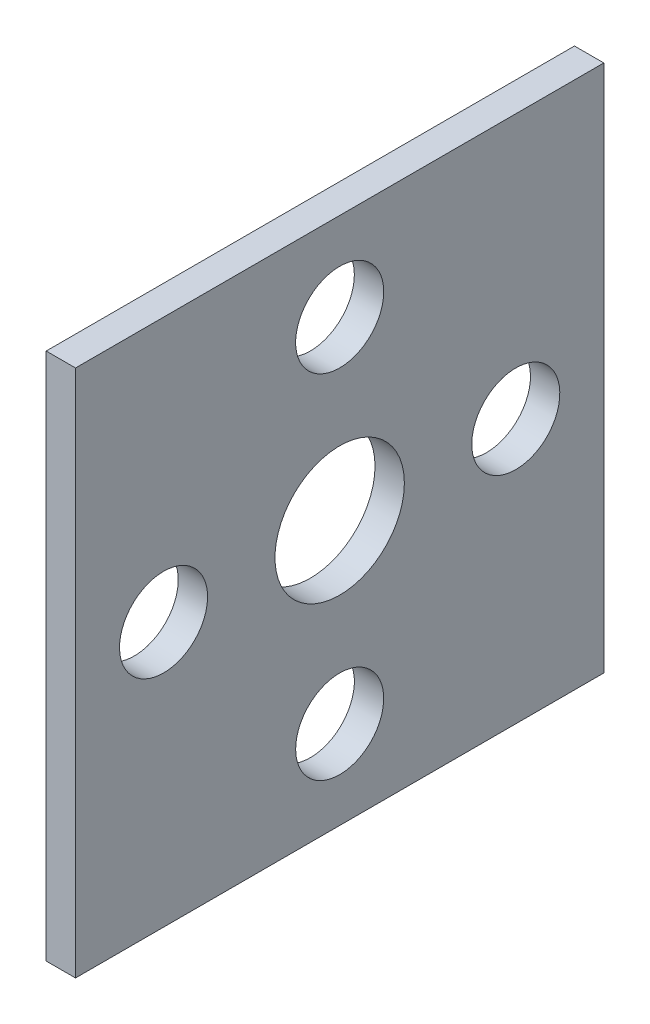
ISO-10303-21;
HEADER;
FILE_DESCRIPTION(('STEP AP214'),'2;1');
FILE_NAME('part.step','',(''),(''),'','','');
FILE_SCHEMA(('AUTOMOTIVE_DESIGN { 1 0 10303 214 1 1 1 1 }'));
ENDSEC;
DATA;
#1=APPLICATION_CONTEXT('core data for automotive mechanical design processes');
#2=APPLICATION_PROTOCOL_DEFINITION('international standard','automotive_design',2000,#1);
#3=PRODUCT_CONTEXT('',#1,'mechanical');
#4=PRODUCT('Part','Part','',(#3));
#5=PRODUCT_RELATED_PRODUCT_CATEGORY('part','',(#4));
#6=PRODUCT_DEFINITION_FORMATION('','',#4);
#7=PRODUCT_DEFINITION_CONTEXT('part definition',#1,'design');
#8=PRODUCT_DEFINITION('design','',#6,#7);
#9=PRODUCT_DEFINITION_SHAPE('','',#8);
#10=(LENGTH_UNIT() NAMED_UNIT(*) SI_UNIT(.MILLI.,.METRE.));
#11=(NAMED_UNIT(*) PLANE_ANGLE_UNIT() SI_UNIT($,.RADIAN.));
#12=(NAMED_UNIT(*) SI_UNIT($,.STERADIAN.) SOLID_ANGLE_UNIT());
#13=UNCERTAINTY_MEASURE_WITH_UNIT(LENGTH_MEASURE(1.E-05),#10,'distance_accuracy_value','');
#14=(GEOMETRIC_REPRESENTATION_CONTEXT(3) GLOBAL_UNCERTAINTY_ASSIGNED_CONTEXT((#13)) GLOBAL_UNIT_ASSIGNED_CONTEXT((#10,
#11,#12)) REPRESENTATION_CONTEXT('',''));
#15=CARTESIAN_POINT('',(0.,0.,0.));
#16=DIRECTION('',(0.,0.,1.));
#17=DIRECTION('',(1.,0.,0.));
#18=AXIS2_PLACEMENT_3D('',#15,#16,#17);
#19=CARTESIAN_POINT('',(3.175,28.575,-28.575));
#20=DIRECTION('',(-1.,0.,0.));
#21=DIRECTION('',(0.,0.,1.));
#22=AXIS2_PLACEMENT_3D('',#19,#20,#21);
#23=PLANE('',#22);
#24=CARTESIAN_POINT('',(3.175,0.,19.05));
#25=DIRECTION('',(1.,0.,0.));
#26=DIRECTION('',(0.,1.,0.));
#27=AXIS2_PLACEMENT_3D('',#24,#25,#26);
#28=CIRCLE('',#27,4.7625);
#29=CARTESIAN_POINT('',(3.175,4.76249999999993,19.05));
#30=VERTEX_POINT('',#29);
#31=EDGE_CURVE('E155',#30,#30,#28,.T.);
#32=ORIENTED_EDGE('',*,*,#31,.F.);
#33=EDGE_LOOP('',(#32));
#34=FACE_BOUND('',#33,.T.);
#35=CARTESIAN_POINT('',(3.175,-19.05,0.));
#36=DIRECTION('',(1.,0.,0.));
#37=DIRECTION('',(0.,0.,1.));
#38=AXIS2_PLACEMENT_3D('',#35,#36,#37);
#39=CIRCLE('',#38,4.7625);
#40=CARTESIAN_POINT('',(3.175,-19.05,4.7625));
#41=VERTEX_POINT('',#40);
#42=EDGE_CURVE('E171',#41,#41,#39,.T.);
#43=ORIENTED_EDGE('',*,*,#42,.F.);
#44=EDGE_LOOP('',(#43));
#45=FACE_BOUND('',#44,.T.);
#46=CARTESIAN_POINT('',(3.175,1.99538158514885E-13,-19.05));
#47=DIRECTION('',(1.,0.,0.));
#48=DIRECTION('',(0.,-1.,0.));
#49=AXIS2_PLACEMENT_3D('',#46,#47,#48);
#50=CIRCLE('',#49,4.7625);
#51=CARTESIAN_POINT('',(3.175,-4.7624999999998,-19.0500000000001));
#52=VERTEX_POINT('',#51);
#53=EDGE_CURVE('E163',#52,#52,#50,.T.);
#54=ORIENTED_EDGE('',*,*,#53,.F.);
#55=EDGE_LOOP('',(#54));
#56=FACE_BOUND('',#55,.T.);
#57=CARTESIAN_POINT('',(3.175,19.05,0.));
#58=DIRECTION('',(1.,0.,0.));
#59=DIRECTION('',(0.,0.,-1.));
#60=AXIS2_PLACEMENT_3D('',#57,#58,#59);
#61=CIRCLE('',#60,4.7625);
#62=CARTESIAN_POINT('',(3.175,19.05,-4.7625));
#63=VERTEX_POINT('',#62);
#64=EDGE_CURVE('E147',#63,#63,#61,.T.);
#65=ORIENTED_EDGE('',*,*,#64,.F.);
#66=EDGE_LOOP('',(#65));
#67=FACE_BOUND('',#66,.T.);
#68=DIRECTION('',(0.,1.,0.));
#69=VECTOR('',#68,1.);
#70=CARTESIAN_POINT('',(3.175,-28.575,-28.575));
#71=LINE('',#70,#69);
#72=CARTESIAN_POINT('',(3.175,-28.575,-28.575));
#73=VERTEX_POINT('',#72);
#74=CARTESIAN_POINT('',(3.175,28.575,-28.575));
#75=VERTEX_POINT('',#74);
#76=EDGE_CURVE('E102',#73,#75,#71,.T.);
#77=ORIENTED_EDGE('',*,*,#76,.T.);
#78=DIRECTION('',(0.,0.,1.));
#79=VECTOR('',#78,1.);
#80=CARTESIAN_POINT('',(3.175,28.575,28.575));
#81=LINE('',#80,#79);
#82=CARTESIAN_POINT('',(3.175,28.575,28.575));
#83=VERTEX_POINT('',#82);
#84=EDGE_CURVE('E97',#75,#83,#81,.T.);
#85=ORIENTED_EDGE('',*,*,#84,.T.);
#86=DIRECTION('',(0.,-1.,0.));
#87=VECTOR('',#86,1.);
#88=CARTESIAN_POINT('',(3.175,-28.575,28.575));
#89=LINE('',#88,#87);
#90=CARTESIAN_POINT('',(3.175,-28.575,28.575));
#91=VERTEX_POINT('',#90);
#92=EDGE_CURVE('E100',#83,#91,#89,.T.);
#93=ORIENTED_EDGE('',*,*,#92,.T.);
#94=DIRECTION('',(0.,0.,-1.));
#95=VECTOR('',#94,1.);
#96=CARTESIAN_POINT('',(3.175,-28.575,28.575));
#97=LINE('',#96,#95);
#98=EDGE_CURVE('E67',#91,#73,#97,.T.);
#99=ORIENTED_EDGE('',*,*,#98,.T.);
#100=EDGE_LOOP('',(#77,#85,#93,#99));
#101=FACE_BOUND('',#100,.T.);
#102=CARTESIAN_POINT('',(3.175,0.,0.));
#103=DIRECTION('',(1.,0.,0.));
#104=DIRECTION('',(0.,0.,-1.));
#105=AXIS2_PLACEMENT_3D('',#102,#103,#104);
#106=CIRCLE('',#105,6.99897);
#107=CARTESIAN_POINT('',(3.175,0.,-6.99897));
#108=VERTEX_POINT('',#107);
#109=EDGE_CURVE('E123',#108,#108,#106,.T.);
#110=ORIENTED_EDGE('',*,*,#109,.F.);
#111=EDGE_LOOP('',(#110));
#112=FACE_BOUND('',#111,.T.);
#113=ADVANCED_FACE('F49',(#34,#45,#56,#67,#101,#112),#23,.F.);
#114=CARTESIAN_POINT('',(0.,28.575,-28.575));
#115=DIRECTION('',(-1.,0.,0.));
#116=DIRECTION('',(0.,0.,1.));
#117=AXIS2_PLACEMENT_3D('',#114,#115,#116);
#118=PLANE('',#117);
#119=CARTESIAN_POINT('',(0.,0.,19.05));
#120=DIRECTION('',(1.,0.,0.));
#121=DIRECTION('',(0.,1.,0.));
#122=AXIS2_PLACEMENT_3D('',#119,#120,#121);
#123=CIRCLE('',#122,4.7625);
#124=CARTESIAN_POINT('',(0.,4.76249999999993,19.05));
#125=VERTEX_POINT('',#124);
#126=EDGE_CURVE('E175',#125,#125,#123,.T.);
#127=ORIENTED_EDGE('',*,*,#126,.T.);
#128=EDGE_LOOP('',(#127));
#129=FACE_BOUND('',#128,.T.);
#130=CARTESIAN_POINT('',(0.,-19.05,0.));
#131=DIRECTION('',(1.,0.,0.));
#132=DIRECTION('',(0.,0.,1.));
#133=AXIS2_PLACEMENT_3D('',#130,#131,#132);
#134=CIRCLE('',#133,4.7625);
#135=CARTESIAN_POINT('',(0.,-19.05,4.7625));
#136=VERTEX_POINT('',#135);
#137=EDGE_CURVE('E167',#136,#136,#134,.T.);
#138=ORIENTED_EDGE('',*,*,#137,.T.);
#139=EDGE_LOOP('',(#138));
#140=FACE_BOUND('',#139,.T.);
#141=CARTESIAN_POINT('',(0.,1.99538158514885E-13,-19.05));
#142=DIRECTION('',(1.,0.,0.));
#143=DIRECTION('',(0.,-1.,0.));
#144=AXIS2_PLACEMENT_3D('',#141,#142,#143);
#145=CIRCLE('',#144,4.7625);
#146=CARTESIAN_POINT('',(0.,-4.7624999999998,-19.0500000000001));
#147=VERTEX_POINT('',#146);
#148=EDGE_CURVE('E159',#147,#147,#145,.T.);
#149=ORIENTED_EDGE('',*,*,#148,.T.);
#150=EDGE_LOOP('',(#149));
#151=FACE_BOUND('',#150,.T.);
#152=CARTESIAN_POINT('',(0.,19.05,0.));
#153=DIRECTION('',(1.,0.,0.));
#154=DIRECTION('',(0.,0.,-1.));
#155=AXIS2_PLACEMENT_3D('',#152,#153,#154);
#156=CIRCLE('',#155,4.7625);
#157=CARTESIAN_POINT('',(0.,19.05,-4.7625));
#158=VERTEX_POINT('',#157);
#159=EDGE_CURVE('E151',#158,#158,#156,.T.);
#160=ORIENTED_EDGE('',*,*,#159,.T.);
#161=EDGE_LOOP('',(#160));
#162=FACE_BOUND('',#161,.T.);
#163=DIRECTION('',(0.,1.,0.));
#164=VECTOR('',#163,1.);
#165=CARTESIAN_POINT('',(0.,-28.575,-28.575));
#166=LINE('',#165,#164);
#167=CARTESIAN_POINT('',(0.,-28.575,-28.575));
#168=VERTEX_POINT('',#167);
#169=CARTESIAN_POINT('',(0.,28.575,-28.575));
#170=VERTEX_POINT('',#169);
#171=EDGE_CURVE('E119',#168,#170,#166,.T.);
#172=ORIENTED_EDGE('',*,*,#171,.F.);
#173=DIRECTION('',(0.,0.,-1.));
#174=VECTOR('',#173,1.);
#175=CARTESIAN_POINT('',(0.,-28.575,28.575));
#176=LINE('',#175,#174);
#177=CARTESIAN_POINT('',(0.,-28.575,28.575));
#178=VERTEX_POINT('',#177);
#179=EDGE_CURVE('E90',#178,#168,#176,.T.);
#180=ORIENTED_EDGE('',*,*,#179,.F.);
#181=DIRECTION('',(0.,-1.,0.));
#182=VECTOR('',#181,1.);
#183=CARTESIAN_POINT('',(0.,-28.575,28.575));
#184=LINE('',#183,#182);
#185=CARTESIAN_POINT('',(0.,28.575,28.575));
#186=VERTEX_POINT('',#185);
#187=EDGE_CURVE('E84',#186,#178,#184,.T.);
#188=ORIENTED_EDGE('',*,*,#187,.F.);
#189=DIRECTION('',(0.,0.,1.));
#190=VECTOR('',#189,1.);
#191=CARTESIAN_POINT('',(0.,28.575,28.575));
#192=LINE('',#191,#190);
#193=EDGE_CURVE('E107',#170,#186,#192,.T.);
#194=ORIENTED_EDGE('',*,*,#193,.F.);
#195=EDGE_LOOP('',(#172,#180,#188,#194));
#196=FACE_BOUND('',#195,.T.);
#197=CARTESIAN_POINT('',(0.,0.,0.));
#198=DIRECTION('',(1.,0.,0.));
#199=DIRECTION('',(0.,0.,-1.));
#200=AXIS2_PLACEMENT_3D('',#197,#198,#199);
#201=CIRCLE('',#200,6.99897);
#202=CARTESIAN_POINT('',(0.,0.,-6.99897));
#203=VERTEX_POINT('',#202);
#204=EDGE_CURVE('E143',#203,#203,#201,.T.);
#205=ORIENTED_EDGE('',*,*,#204,.T.);
#206=EDGE_LOOP('',(#205));
#207=FACE_BOUND('',#206,.T.);
#208=ADVANCED_FACE('F137',(#129,#140,#151,#162,#196,#207),#118,.T.);
#209=CARTESIAN_POINT('',(3.175,-28.575,-28.575));
#210=DIRECTION('',(0.,0.,1.));
#211=DIRECTION('',(1.,0.,0.));
#212=AXIS2_PLACEMENT_3D('',#209,#210,#211);
#213=PLANE('',#212);
#214=ORIENTED_EDGE('',*,*,#171,.T.);
#215=DIRECTION('',(-1.,0.,0.));
#216=VECTOR('',#215,1.);
#217=CARTESIAN_POINT('',(3.175,28.575,-28.575));
#218=LINE('',#217,#216);
#219=EDGE_CURVE('E13',#75,#170,#218,.T.);
#220=ORIENTED_EDGE('',*,*,#219,.F.);
#221=ORIENTED_EDGE('',*,*,#76,.F.);
#222=DIRECTION('',(-1.,0.,0.));
#223=VECTOR('',#222,1.);
#224=CARTESIAN_POINT('',(3.175,-28.575,-28.575));
#225=LINE('',#224,#223);
#226=EDGE_CURVE('E115',#73,#168,#225,.T.);
#227=ORIENTED_EDGE('',*,*,#226,.T.);
#228=EDGE_LOOP('',(#214,#220,#221,#227));
#229=FACE_BOUND('',#228,.T.);
#230=ADVANCED_FACE('F51',(#229),#213,.F.);
#231=CARTESIAN_POINT('',(3.175,28.575,28.575));
#232=DIRECTION('',(0.,-1.,0.));
#233=DIRECTION('',(0.,0.,-1.));
#234=AXIS2_PLACEMENT_3D('',#231,#232,#233);
#235=PLANE('',#234);
#236=ORIENTED_EDGE('',*,*,#193,.T.);
#237=DIRECTION('',(-1.,0.,0.));
#238=VECTOR('',#237,1.);
#239=CARTESIAN_POINT('',(3.175,28.575,28.575));
#240=LINE('',#239,#238);
#241=EDGE_CURVE('E59',#83,#186,#240,.T.);
#242=ORIENTED_EDGE('',*,*,#241,.F.);
#243=ORIENTED_EDGE('',*,*,#84,.F.);
#244=ORIENTED_EDGE('',*,*,#219,.T.);
#245=EDGE_LOOP('',(#236,#242,#243,#244));
#246=FACE_BOUND('',#245,.T.);
#247=ADVANCED_FACE('F106',(#246),#235,.F.);
#248=CARTESIAN_POINT('',(3.175,-28.575,28.575));
#249=DIRECTION('',(0.,0.,-1.));
#250=DIRECTION('',(-1.,0.,0.));
#251=AXIS2_PLACEMENT_3D('',#248,#249,#250);
#252=PLANE('',#251);
#253=ORIENTED_EDGE('',*,*,#187,.T.);
#254=DIRECTION('',(-1.,0.,0.));
#255=VECTOR('',#254,1.);
#256=CARTESIAN_POINT('',(3.175,-28.575,28.575));
#257=LINE('',#256,#255);
#258=EDGE_CURVE('E109',#91,#178,#257,.T.);
#259=ORIENTED_EDGE('',*,*,#258,.F.);
#260=ORIENTED_EDGE('',*,*,#92,.F.);
#261=ORIENTED_EDGE('',*,*,#241,.T.);
#262=EDGE_LOOP('',(#253,#259,#260,#261));
#263=FACE_BOUND('',#262,.T.);
#264=ADVANCED_FACE('F110',(#263),#252,.F.);
#265=CARTESIAN_POINT('',(3.175,-28.575,28.575));
#266=DIRECTION('',(0.,1.,0.));
#267=DIRECTION('',(0.,0.,1.));
#268=AXIS2_PLACEMENT_3D('',#265,#266,#267);
#269=PLANE('',#268);
#270=ORIENTED_EDGE('',*,*,#179,.T.);
#271=ORIENTED_EDGE('',*,*,#226,.F.);
#272=ORIENTED_EDGE('',*,*,#98,.F.);
#273=ORIENTED_EDGE('',*,*,#258,.T.);
#274=EDGE_LOOP('',(#270,#271,#272,#273));
#275=FACE_BOUND('',#274,.T.);
#276=ADVANCED_FACE('F134',(#275),#269,.F.);
#277=CARTESIAN_POINT('',(3.175,0.,0.));
#278=DIRECTION('',(-1.,0.,0.));
#279=DIRECTION('',(0.,0.,1.));
#280=AXIS2_PLACEMENT_3D('',#277,#278,#279);
#281=CYLINDRICAL_SURFACE('',#280,6.99897);
#282=ORIENTED_EDGE('',*,*,#109,.T.);
#283=EDGE_LOOP('',(#282));
#284=FACE_BOUND('',#283,.T.);
#285=ORIENTED_EDGE('',*,*,#204,.F.);
#286=EDGE_LOOP('',(#285));
#287=FACE_BOUND('',#286,.T.);
#288=ADVANCED_FACE('F200',(#284,#287),#281,.F.);
#289=CARTESIAN_POINT('',(3.175,19.05,0.));
#290=DIRECTION('',(-1.,0.,0.));
#291=DIRECTION('',(0.,0.,1.));
#292=AXIS2_PLACEMENT_3D('',#289,#290,#291);
#293=CYLINDRICAL_SURFACE('',#292,4.7625);
#294=ORIENTED_EDGE('',*,*,#64,.T.);
#295=EDGE_LOOP('',(#294));
#296=FACE_BOUND('',#295,.T.);
#297=ORIENTED_EDGE('',*,*,#159,.F.);
#298=EDGE_LOOP('',(#297));
#299=FACE_BOUND('',#298,.T.);
#300=ADVANCED_FACE('F196',(#296,#299),#293,.F.);
#301=CARTESIAN_POINT('',(3.175,1.99538158514885E-13,-19.05));
#302=DIRECTION('',(-1.,0.,0.));
#303=DIRECTION('',(0.,0.,1.));
#304=AXIS2_PLACEMENT_3D('',#301,#302,#303);
#305=CYLINDRICAL_SURFACE('',#304,4.7625);
#306=ORIENTED_EDGE('',*,*,#53,.T.);
#307=EDGE_LOOP('',(#306));
#308=FACE_BOUND('',#307,.T.);
#309=ORIENTED_EDGE('',*,*,#148,.F.);
#310=EDGE_LOOP('',(#309));
#311=FACE_BOUND('',#310,.T.);
#312=ADVANCED_FACE('F199',(#308,#311),#305,.F.);
#313=CARTESIAN_POINT('',(3.175,-19.05,0.));
#314=DIRECTION('',(-1.,0.,0.));
#315=DIRECTION('',(0.,0.,1.));
#316=AXIS2_PLACEMENT_3D('',#313,#314,#315);
#317=CYLINDRICAL_SURFACE('',#316,4.7625);
#318=ORIENTED_EDGE('',*,*,#42,.T.);
#319=EDGE_LOOP('',(#318));
#320=FACE_BOUND('',#319,.T.);
#321=ORIENTED_EDGE('',*,*,#137,.F.);
#322=EDGE_LOOP('',(#321));
#323=FACE_BOUND('',#322,.T.);
#324=ADVANCED_FACE('F245',(#320,#323),#317,.F.);
#325=CARTESIAN_POINT('',(3.175,0.,19.05));
#326=DIRECTION('',(-1.,0.,0.));
#327=DIRECTION('',(0.,0.,1.));
#328=AXIS2_PLACEMENT_3D('',#325,#326,#327);
#329=CYLINDRICAL_SURFACE('',#328,4.7625);
#330=ORIENTED_EDGE('',*,*,#31,.T.);
#331=EDGE_LOOP('',(#330));
#332=FACE_BOUND('',#331,.T.);
#333=ORIENTED_EDGE('',*,*,#126,.F.);
#334=EDGE_LOOP('',(#333));
#335=FACE_BOUND('',#334,.T.);
#336=ADVANCED_FACE('F184',(#332,#335),#329,.F.);
#337=CLOSED_SHELL('',(#113,#208,#230,#247,#264,#276,#288,#300,#312,#324,#336));
#338=MANIFOLD_SOLID_BREP('B2',#337);
#339=ADVANCED_BREP_SHAPE_REPRESENTATION('',(#18,#338),#14);
#340=SHAPE_DEFINITION_REPRESENTATION(#9,#339);
ENDSEC;
END-ISO-10303-21;
